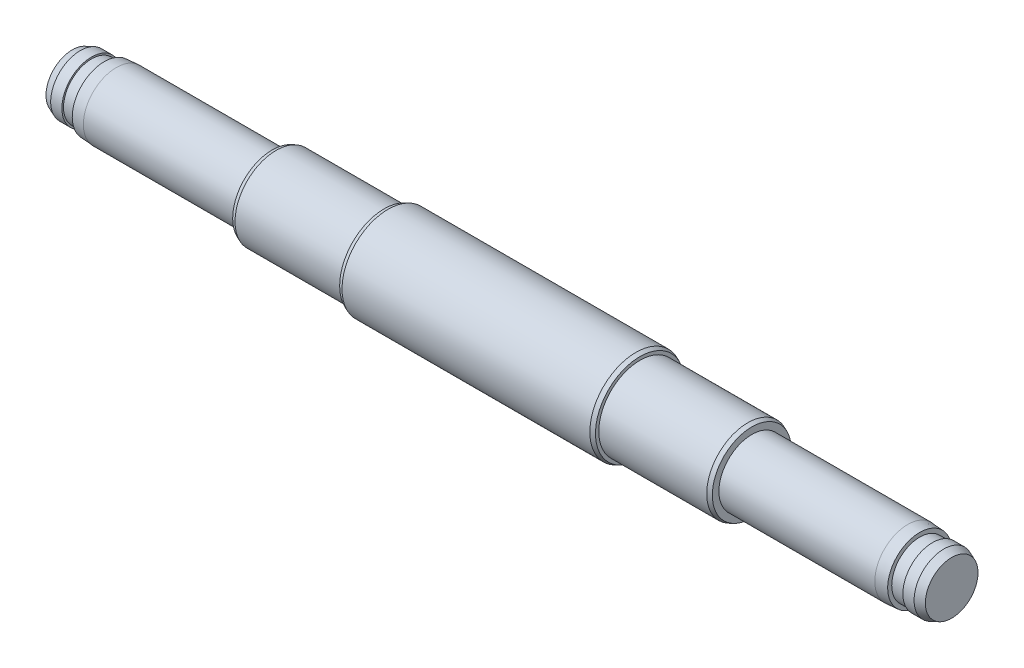
ISO-10303-21;
HEADER;
FILE_DESCRIPTION(('STEP AP214'),'2;1');
FILE_NAME('part.step','',(''),(''),'','','');
FILE_SCHEMA(('AUTOMOTIVE_DESIGN { 1 0 10303 214 1 1 1 1 }'));
ENDSEC;
DATA;
#1=APPLICATION_CONTEXT('core data for automotive mechanical design processes');
#2=APPLICATION_PROTOCOL_DEFINITION('international standard','automotive_design',2000,#1);
#3=PRODUCT_CONTEXT('',#1,'mechanical');
#4=PRODUCT('Part','Part','',(#3));
#5=PRODUCT_RELATED_PRODUCT_CATEGORY('part','',(#4));
#6=PRODUCT_DEFINITION_FORMATION('','',#4);
#7=PRODUCT_DEFINITION_CONTEXT('part definition',#1,'design');
#8=PRODUCT_DEFINITION('design','',#6,#7);
#9=PRODUCT_DEFINITION_SHAPE('','',#8);
#10=(LENGTH_UNIT() NAMED_UNIT(*) SI_UNIT(.MILLI.,.METRE.));
#11=(NAMED_UNIT(*) PLANE_ANGLE_UNIT() SI_UNIT($,.RADIAN.));
#12=(NAMED_UNIT(*) SI_UNIT($,.STERADIAN.) SOLID_ANGLE_UNIT());
#13=UNCERTAINTY_MEASURE_WITH_UNIT(LENGTH_MEASURE(1.E-05),#10,'distance_accuracy_value','');
#14=(GEOMETRIC_REPRESENTATION_CONTEXT(3) GLOBAL_UNCERTAINTY_ASSIGNED_CONTEXT((#13)) GLOBAL_UNIT_ASSIGNED_CONTEXT((#10,
#11,#12)) REPRESENTATION_CONTEXT('',''));
#15=CARTESIAN_POINT('',(0.,0.,0.));
#16=DIRECTION('',(0.,0.,1.));
#17=DIRECTION('',(1.,0.,0.));
#18=AXIS2_PLACEMENT_3D('',#15,#16,#17);
#19=CARTESIAN_POINT('',(0.,0.,0.));
#20=DIRECTION('',(-1.,0.,0.));
#21=DIRECTION('',(0.,0.,1.));
#22=AXIS2_PLACEMENT_3D('',#19,#20,#21);
#23=CYLINDRICAL_SURFACE('',#22,4.9);
#24=CARTESIAN_POINT('',(13.175,0.,0.));
#25=DIRECTION('',(-1.,0.,0.));
#26=DIRECTION('',(0.,-1.,0.));
#27=AXIS2_PLACEMENT_3D('',#24,#25,#26);
#28=CIRCLE('',#27,4.9);
#29=CARTESIAN_POINT('',(13.175,-4.9,0.));
#30=VERTEX_POINT('',#29);
#31=EDGE_CURVE('E51',#30,#30,#28,.T.);
#32=ORIENTED_EDGE('',*,*,#31,.T.);
#33=EDGE_LOOP('',(#32));
#34=FACE_BOUND('',#33,.T.);
#35=CARTESIAN_POINT('',(-13.175,0.,0.));
#36=DIRECTION('',(1.,0.,0.));
#37=DIRECTION('',(0.,0.,-1.));
#38=AXIS2_PLACEMENT_3D('',#35,#36,#37);
#39=CIRCLE('',#38,4.9);
#40=CARTESIAN_POINT('',(-13.175,0.,-4.9));
#41=VERTEX_POINT('',#40);
#42=EDGE_CURVE('E65',#41,#41,#39,.T.);
#43=ORIENTED_EDGE('',*,*,#42,.T.);
#44=EDGE_LOOP('',(#43));
#45=FACE_BOUND('',#44,.T.);
#46=ADVANCED_FACE('F38',(#34,#45),#23,.T.);
#47=CARTESIAN_POINT('',(-13.6,0.,0.));
#48=DIRECTION('',(-1.,0.,0.));
#49=DIRECTION('',(0.,0.,1.));
#50=AXIS2_PLACEMENT_3D('',#47,#48,#49);
#51=PLANE('',#50);
#52=CARTESIAN_POINT('',(-13.6,0.,0.));
#53=DIRECTION('',(-1.,0.,0.));
#54=DIRECTION('',(0.,0.,1.));
#55=AXIS2_PLACEMENT_3D('',#52,#53,#54);
#56=CIRCLE('',#55,4.72499999999999);
#57=CARTESIAN_POINT('',(-13.6,0.,4.72499999999999));
#58=VERTEX_POINT('',#57);
#59=EDGE_CURVE('E10',#58,#58,#56,.T.);
#60=ORIENTED_EDGE('',*,*,#59,.T.);
#61=EDGE_LOOP('',(#60));
#62=FACE_BOUND('',#61,.T.);
#63=CARTESIAN_POINT('',(-13.6,0.,0.));
#64=DIRECTION('',(-1.,0.,0.));
#65=DIRECTION('',(0.,0.,1.));
#66=AXIS2_PLACEMENT_3D('',#63,#64,#65);
#67=CIRCLE('',#66,4.375);
#68=CARTESIAN_POINT('',(-13.6,0.,4.375));
#69=VERTEX_POINT('',#68);
#70=EDGE_CURVE('E57',#69,#69,#67,.T.);
#71=ORIENTED_EDGE('',*,*,#70,.F.);
#72=EDGE_LOOP('',(#71));
#73=FACE_BOUND('',#72,.T.);
#74=ADVANCED_FACE('F147',(#62,#73),#51,.T.);
#75=CARTESIAN_POINT('',(-13.6,0.,0.));
#76=DIRECTION('',(-1.,0.,0.));
#77=DIRECTION('',(0.,0.,1.));
#78=AXIS2_PLACEMENT_3D('',#75,#76,#77);
#79=CYLINDRICAL_SURFACE('',#78,4.375);
#80=CARTESIAN_POINT('',(-25.075,0.,0.));
#81=DIRECTION('',(1.,0.,0.));
#82=DIRECTION('',(0.,1.,0.));
#83=AXIS2_PLACEMENT_3D('',#80,#81,#82);
#84=CIRCLE('',#83,4.375);
#85=CARTESIAN_POINT('',(-25.075,0.,4.375));
#86=VERTEX_POINT('',#85);
#87=EDGE_CURVE('E62',#86,#86,#84,.T.);
#88=CARTESIAN_POINT('',(-25.075,0.,4.375));
#89=CARTESIAN_POINT('',(-24.95546875,0.,4.375));
#90=CARTESIAN_POINT('',(-24.8359375,0.,4.375));
#91=CARTESIAN_POINT('',(-24.596875,0.,4.375));
#92=CARTESIAN_POINT('',(-24.47734375,0.,4.375));
#93=CARTESIAN_POINT('',(-24.23828125,0.,4.375));
#94=CARTESIAN_POINT('',(-24.11875,0.,4.375));
#95=CARTESIAN_POINT('',(-23.8796875,0.,4.375));
#96=CARTESIAN_POINT('',(-23.76015625,0.,4.375));
#97=CARTESIAN_POINT('',(-23.52109375,0.,4.375));
#98=CARTESIAN_POINT('',(-23.4015625,0.,4.375));
#99=CARTESIAN_POINT('',(-23.1625,0.,4.375));
#100=CARTESIAN_POINT('',(-23.04296875,0.,4.375));
#101=CARTESIAN_POINT('',(-22.80390625,0.,4.375));
#102=CARTESIAN_POINT('',(-22.684375,0.,4.375));
#103=CARTESIAN_POINT('',(-22.4453125,0.,4.375));
#104=CARTESIAN_POINT('',(-22.32578125,0.,4.375));
#105=CARTESIAN_POINT('',(-22.08671875,0.,4.375));
#106=CARTESIAN_POINT('',(-21.9671875,0.,4.375));
#107=CARTESIAN_POINT('',(-21.728125,0.,4.375));
#108=CARTESIAN_POINT('',(-21.60859375,0.,4.375));
#109=CARTESIAN_POINT('',(-21.36953125,0.,4.375));
#110=CARTESIAN_POINT('',(-21.25,0.,4.375));
#111=CARTESIAN_POINT('',(-21.0109375,0.,4.375));
#112=CARTESIAN_POINT('',(-20.89140625,0.,4.375));
#113=CARTESIAN_POINT('',(-20.65234375,0.,4.375));
#114=CARTESIAN_POINT('',(-20.5328125,0.,4.375));
#115=CARTESIAN_POINT('',(-20.29375,0.,4.375));
#116=CARTESIAN_POINT('',(-20.17421875,0.,4.375));
#117=CARTESIAN_POINT('',(-19.93515625,0.,4.375));
#118=CARTESIAN_POINT('',(-19.815625,0.,4.375));
#119=CARTESIAN_POINT('',(-19.5765625,0.,4.375));
#120=CARTESIAN_POINT('',(-19.45703125,0.,4.375));
#121=CARTESIAN_POINT('',(-19.21796875,0.,4.375));
#122=CARTESIAN_POINT('',(-19.0984375,0.,4.375));
#123=CARTESIAN_POINT('',(-18.859375,0.,4.375));
#124=CARTESIAN_POINT('',(-18.73984375,0.,4.375));
#125=CARTESIAN_POINT('',(-18.50078125,0.,4.375));
#126=CARTESIAN_POINT('',(-18.38125,0.,4.375));
#127=CARTESIAN_POINT('',(-18.1421875,0.,4.375));
#128=CARTESIAN_POINT('',(-18.02265625,0.,4.375));
#129=CARTESIAN_POINT('',(-17.78359375,0.,4.375));
#130=CARTESIAN_POINT('',(-17.6640625,0.,4.375));
#131=CARTESIAN_POINT('',(-17.425,0.,4.375));
#132=CARTESIAN_POINT('',(-17.30546875,0.,4.375));
#133=CARTESIAN_POINT('',(-17.06640625,0.,4.375));
#134=CARTESIAN_POINT('',(-16.946875,0.,4.375));
#135=CARTESIAN_POINT('',(-16.7078125,0.,4.375));
#136=CARTESIAN_POINT('',(-16.58828125,0.,4.375));
#137=CARTESIAN_POINT('',(-16.34921875,0.,4.375));
#138=CARTESIAN_POINT('',(-16.2296875,0.,4.375));
#139=CARTESIAN_POINT('',(-15.990625,0.,4.375));
#140=CARTESIAN_POINT('',(-15.87109375,0.,4.375));
#141=CARTESIAN_POINT('',(-15.63203125,0.,4.375));
#142=CARTESIAN_POINT('',(-15.5125,0.,4.375));
#143=CARTESIAN_POINT('',(-15.2734375,0.,4.375));
#144=CARTESIAN_POINT('',(-15.15390625,0.,4.375));
#145=CARTESIAN_POINT('',(-14.91484375,0.,4.375));
#146=CARTESIAN_POINT('',(-14.7953125,0.,4.375));
#147=CARTESIAN_POINT('',(-14.55625,0.,4.375));
#148=CARTESIAN_POINT('',(-14.43671875,0.,4.375));
#149=CARTESIAN_POINT('',(-14.19765625,0.,4.375));
#150=CARTESIAN_POINT('',(-14.078125,0.,4.375));
#151=CARTESIAN_POINT('',(-13.8390625,0.,4.375));
#152=CARTESIAN_POINT('',(-13.71953125,0.,4.375));
#153=CARTESIAN_POINT('',(-13.6,0.,4.375));
#154=B_SPLINE_CURVE_WITH_KNOTS('',3,(#88,#89,#90,#91,#92,#93,#94,#95,#96,#97,#98,#99,#100,#101,
#102,#103,#104,#105,#106,#107,#108,#109,#110,#111,#112,#113,#114,#115,#116,#117,#118,#119,#120,
#121,#122,#123,#124,#125,#126,#127,#128,#129,#130,#131,#132,#133,#134,#135,#136,#137,#138,#139,
#140,#141,#142,#143,#144,#145,#146,#147,#148,#149,#150,#151,#152,#153),.UNSPECIFIED.,.F.,.F.,(4,
2,2,2,2,2,2,2,2,2,2,2,2,2,2,2,2,2,2,2,2,2,2,2,2,2,2,2,2,2,2,2,4),(0.,0.35859375,
0.717187500000001,1.07578125,1.434375,1.79296875,2.1515625,2.51015625,2.86875,3.22734375,
3.5859375,3.94453125,4.303125,4.66171875,5.0203125,5.37890625,5.7375,6.09609375,6.4546875,
6.81328125,7.171875,7.53046875,7.8890625,8.24765625,8.60625,8.96484375,9.3234375,9.68203125,
10.040625,10.39921875,10.7578125,11.11640625,11.475),.UNSPECIFIED.);
#155=EDGE_CURVE('BSEAM152',#86,#69,#154,.T.);
#156=ORIENTED_EDGE('',*,*,#87,.T.);
#157=ORIENTED_EDGE('',*,*,#70,.T.);
#158=ORIENTED_EDGE('',*,*,#155,.T.);
#159=ORIENTED_EDGE('',*,*,#155,.F.);
#160=EDGE_LOOP('',(#156,#158,#157,#159));
#161=FACE_BOUND('',#160,.T.);
#162=ADVANCED_FACE('F152',(#161),#79,.T.);
#163=CARTESIAN_POINT('',(-46.75,3.15,0.));
#164=DIRECTION('',(1.,0.,0.));
#165=DIRECTION('',(0.,0.,1.));
#166=AXIS2_PLACEMENT_3D('',#163,#164,#165);
#167=PLANE('',#166);
#168=CARTESIAN_POINT('',(-46.75,0.,0.));
#169=DIRECTION('',(-1.,0.,0.));
#170=DIRECTION('',(0.,-1.,0.));
#171=AXIS2_PLACEMENT_3D('',#168,#169,#170);
#172=CIRCLE('',#171,2.8);
#173=CARTESIAN_POINT('',(-46.75,-2.8,0.));
#174=VERTEX_POINT('',#173);
#175=EDGE_CURVE('E42',#174,#174,#172,.T.);
#176=ORIENTED_EDGE('',*,*,#175,.T.);
#177=EDGE_LOOP('',(#176));
#178=FACE_BOUND('',#177,.T.);
#179=ADVANCED_FACE('F157',(#178),#167,.F.);
#180=CARTESIAN_POINT('',(-45.9,0.,0.));
#181=DIRECTION('',(1.,0.,0.));
#182=DIRECTION('',(0.,1.,0.));
#183=AXIS2_PLACEMENT_3D('',#180,#181,#182);
#184=CONICAL_SURFACE('',#183,3.15,0.390607043697686);
#185=CARTESIAN_POINT('',(-45.9,0.,0.));
#186=DIRECTION('',(1.,0.,0.));
#187=DIRECTION('',(0.,0.,-1.));
#188=AXIS2_PLACEMENT_3D('',#185,#186,#187);
#189=CIRCLE('',#188,3.15);
#190=CARTESIAN_POINT('',(-45.9,0.,-3.15));
#191=VERTEX_POINT('',#190);
#192=EDGE_CURVE('E91',#191,#191,#189,.T.);
#193=ORIENTED_EDGE('',*,*,#192,.F.);
#194=EDGE_LOOP('',(#193));
#195=FACE_BOUND('',#194,.T.);
#196=ORIENTED_EDGE('',*,*,#175,.F.);
#197=EDGE_LOOP('',(#196));
#198=FACE_BOUND('',#197,.T.);
#199=ADVANCED_FACE('F161',(#195,#198),#184,.T.);
#200=CARTESIAN_POINT('',(0.,0.,0.));
#201=DIRECTION('',(1.,0.,0.));
#202=DIRECTION('',(0.,0.,-1.));
#203=AXIS2_PLACEMENT_3D('',#200,#201,#202);
#204=CYLINDRICAL_SURFACE('',#203,3.15);
#205=ORIENTED_EDGE('',*,*,#192,.T.);
#206=EDGE_LOOP('',(#205));
#207=FACE_BOUND('',#206,.T.);
#208=CARTESIAN_POINT('',(-44.71,0.,0.));
#209=DIRECTION('',(1.,0.,0.));
#210=DIRECTION('',(0.,0.,-1.));
#211=AXIS2_PLACEMENT_3D('',#208,#209,#210);
#212=CIRCLE('',#211,3.15);
#213=CARTESIAN_POINT('',(-44.71,0.,-3.15));
#214=VERTEX_POINT('',#213);
#215=EDGE_CURVE('E88',#214,#214,#212,.T.);
#216=ORIENTED_EDGE('',*,*,#215,.F.);
#217=EDGE_LOOP('',(#216));
#218=FACE_BOUND('',#217,.T.);
#219=ADVANCED_FACE('F164',(#207,#218),#204,.T.);
#220=CARTESIAN_POINT('',(-44.71,0.,-2.975));
#221=DIRECTION('',(1.,0.,0.));
#222=DIRECTION('',(0.,0.,1.));
#223=AXIS2_PLACEMENT_3D('',#220,#221,#222);
#224=PLANE('',#223);
#225=CARTESIAN_POINT('',(-44.71,0.,0.));
#226=DIRECTION('',(-1.,0.,0.));
#227=DIRECTION('',(0.,0.,1.));
#228=AXIS2_PLACEMENT_3D('',#225,#226,#227);
#229=CIRCLE('',#228,2.975);
#230=CARTESIAN_POINT('',(-44.71,0.,2.975));
#231=VERTEX_POINT('',#230);
#232=EDGE_CURVE('E85',#231,#231,#229,.T.);
#233=ORIENTED_EDGE('',*,*,#232,.T.);
#234=EDGE_LOOP('',(#233));
#235=FACE_BOUND('',#234,.T.);
#236=ORIENTED_EDGE('',*,*,#215,.T.);
#237=EDGE_LOOP('',(#236));
#238=FACE_BOUND('',#237,.T.);
#239=ADVANCED_FACE('F168',(#235,#238),#224,.T.);
#240=CARTESIAN_POINT('',(0.,0.,0.));
#241=DIRECTION('',(1.,0.,0.));
#242=DIRECTION('',(0.,0.,-1.));
#243=AXIS2_PLACEMENT_3D('',#240,#241,#242);
#244=CYLINDRICAL_SURFACE('',#243,2.975);
#245=ORIENTED_EDGE('',*,*,#232,.F.);
#246=EDGE_LOOP('',(#245));
#247=FACE_BOUND('',#246,.T.);
#248=CARTESIAN_POINT('',(-43.35,0.,0.));
#249=DIRECTION('',(-1.,0.,0.));
#250=DIRECTION('',(0.,0.,1.));
#251=AXIS2_PLACEMENT_3D('',#248,#249,#250);
#252=CIRCLE('',#251,2.975);
#253=CARTESIAN_POINT('',(-43.35,0.,2.975));
#254=VERTEX_POINT('',#253);
#255=EDGE_CURVE('E60',#254,#254,#252,.T.);
#256=ORIENTED_EDGE('',*,*,#255,.T.);
#257=EDGE_LOOP('',(#256));
#258=FACE_BOUND('',#257,.T.);
#259=ADVANCED_FACE('F171',(#247,#258),#244,.T.);
#260=CARTESIAN_POINT('',(-43.35,3.5,0.));
#261=DIRECTION('',(1.,0.,0.));
#262=DIRECTION('',(0.,0.,1.));
#263=AXIS2_PLACEMENT_3D('',#260,#261,#262);
#264=PLANE('',#263);
#265=CARTESIAN_POINT('',(-43.35,0.,0.));
#266=DIRECTION('',(-1.,0.,0.));
#267=DIRECTION('',(0.,0.,1.));
#268=AXIS2_PLACEMENT_3D('',#265,#266,#267);
#269=CIRCLE('',#268,3.40742833512805);
#270=CARTESIAN_POINT('',(-43.35,0.,3.40742833512805));
#271=VERTEX_POINT('',#270);
#272=EDGE_CURVE('E79',#271,#271,#269,.T.);
#273=ORIENTED_EDGE('',*,*,#272,.T.);
#274=EDGE_LOOP('',(#273));
#275=FACE_BOUND('',#274,.T.);
#276=ORIENTED_EDGE('',*,*,#255,.F.);
#277=EDGE_LOOP('',(#276));
#278=FACE_BOUND('',#277,.T.);
#279=ADVANCED_FACE('F175',(#275,#278),#264,.F.);
#280=CARTESIAN_POINT('',(-42.075,0.,0.));
#281=DIRECTION('',(1.,0.,0.));
#282=DIRECTION('',(0.,0.,-1.));
#283=AXIS2_PLACEMENT_3D('',#280,#281,#282);
#284=CONICAL_SURFACE('',#283,3.5,0.072478049415304);
#285=CARTESIAN_POINT('',(-42.075,0.,0.));
#286=DIRECTION('',(1.,0.,0.));
#287=DIRECTION('',(0.,1.,0.));
#288=AXIS2_PLACEMENT_3D('',#285,#286,#287);
#289=CIRCLE('',#288,3.5);
#290=CARTESIAN_POINT('',(-42.075,3.5,0.));
#291=VERTEX_POINT('',#290);
#292=EDGE_CURVE('E75',#291,#291,#289,.T.);
#293=ORIENTED_EDGE('',*,*,#292,.F.);
#294=EDGE_LOOP('',(#293));
#295=FACE_BOUND('',#294,.T.);
#296=ORIENTED_EDGE('',*,*,#272,.F.);
#297=EDGE_LOOP('',(#296));
#298=FACE_BOUND('',#297,.T.);
#299=ADVANCED_FACE('F179',(#295,#298),#284,.T.);
#300=CARTESIAN_POINT('',(0.,0.,0.));
#301=DIRECTION('',(1.,0.,0.));
#302=DIRECTION('',(0.,0.,-1.));
#303=AXIS2_PLACEMENT_3D('',#300,#301,#302);
#304=CYLINDRICAL_SURFACE('',#303,3.5);
#305=ORIENTED_EDGE('',*,*,#292,.T.);
#306=EDGE_LOOP('',(#305));
#307=FACE_BOUND('',#306,.T.);
#308=CARTESIAN_POINT('',(-25.5,0.,0.));
#309=DIRECTION('',(-1.,0.,0.));
#310=DIRECTION('',(0.,0.,1.));
#311=AXIS2_PLACEMENT_3D('',#308,#309,#310);
#312=CIRCLE('',#311,3.5);
#313=CARTESIAN_POINT('',(-25.5,0.,3.5));
#314=VERTEX_POINT('',#313);
#315=EDGE_CURVE('E70',#314,#314,#312,.T.);
#316=ORIENTED_EDGE('',*,*,#315,.T.);
#317=EDGE_LOOP('',(#316));
#318=FACE_BOUND('',#317,.T.);
#319=ADVANCED_FACE('F183',(#307,#318),#304,.T.);
#320=CARTESIAN_POINT('',(-25.5,4.9,0.));
#321=DIRECTION('',(1.,0.,0.));
#322=DIRECTION('',(0.,0.,1.));
#323=AXIS2_PLACEMENT_3D('',#320,#321,#322);
#324=PLANE('',#323);
#325=CARTESIAN_POINT('',(-25.5,0.,0.));
#326=DIRECTION('',(-1.,0.,0.));
#327=DIRECTION('',(0.,0.,1.));
#328=AXIS2_PLACEMENT_3D('',#325,#326,#327);
#329=CIRCLE('',#328,4.19999999999999);
#330=CARTESIAN_POINT('',(-25.5,0.,4.19999999999999));
#331=VERTEX_POINT('',#330);
#332=EDGE_CURVE('E66',#331,#331,#329,.T.);
#333=ORIENTED_EDGE('',*,*,#332,.T.);
#334=EDGE_LOOP('',(#333));
#335=FACE_BOUND('',#334,.T.);
#336=ORIENTED_EDGE('',*,*,#315,.F.);
#337=EDGE_LOOP('',(#336));
#338=FACE_BOUND('',#337,.T.);
#339=ADVANCED_FACE('F187',(#335,#338),#324,.F.);
#340=CARTESIAN_POINT('',(13.6,0.,0.));
#341=DIRECTION('',(1.,0.,0.));
#342=DIRECTION('',(0.,0.,1.));
#343=AXIS2_PLACEMENT_3D('',#340,#341,#342);
#344=PLANE('',#343);
#345=CARTESIAN_POINT('',(13.6,0.,0.));
#346=DIRECTION('',(1.,0.,0.));
#347=DIRECTION('',(0.,0.,-1.));
#348=AXIS2_PLACEMENT_3D('',#345,#346,#347);
#349=CIRCLE('',#348,4.725);
#350=CARTESIAN_POINT('',(13.6,0.,-4.725));
#351=VERTEX_POINT('',#350);
#352=EDGE_CURVE('E46',#351,#351,#349,.T.);
#353=ORIENTED_EDGE('',*,*,#352,.T.);
#354=EDGE_LOOP('',(#353));
#355=FACE_BOUND('',#354,.T.);
#356=CARTESIAN_POINT('',(13.6,0.,0.));
#357=DIRECTION('',(-1.,0.,0.));
#358=DIRECTION('',(0.,0.,1.));
#359=AXIS2_PLACEMENT_3D('',#356,#357,#358);
#360=CIRCLE('',#359,4.375);
#361=CARTESIAN_POINT('',(13.6,0.,-4.375));
#362=VERTEX_POINT('',#361);
#363=EDGE_CURVE('E61',#362,#362,#360,.T.);
#364=ORIENTED_EDGE('',*,*,#363,.T.);
#365=EDGE_LOOP('',(#364));
#366=FACE_BOUND('',#365,.T.);
#367=ADVANCED_FACE('F191',(#355,#366),#344,.T.);
#368=CARTESIAN_POINT('',(13.6,0.,0.));
#369=DIRECTION('',(1.,0.,0.));
#370=DIRECTION('',(0.,0.,-1.));
#371=AXIS2_PLACEMENT_3D('',#368,#369,#370);
#372=CYLINDRICAL_SURFACE('',#371,4.375);
#373=CARTESIAN_POINT('',(25.075,0.,0.));
#374=DIRECTION('',(-1.,0.,0.));
#375=DIRECTION('',(0.,0.,1.));
#376=AXIS2_PLACEMENT_3D('',#373,#374,#375);
#377=CIRCLE('',#376,4.375);
#378=CARTESIAN_POINT('',(25.075,0.,-4.375));
#379=VERTEX_POINT('',#378);
#380=EDGE_CURVE('E93',#379,#379,#377,.T.);
#381=CARTESIAN_POINT('',(25.075,0.,-4.375));
#382=CARTESIAN_POINT('',(24.95546875,0.,-4.375));
#383=CARTESIAN_POINT('',(24.8359375,0.,-4.375));
#384=CARTESIAN_POINT('',(24.596875,0.,-4.375));
#385=CARTESIAN_POINT('',(24.47734375,0.,-4.375));
#386=CARTESIAN_POINT('',(24.23828125,0.,-4.375));
#387=CARTESIAN_POINT('',(24.11875,0.,-4.375));
#388=CARTESIAN_POINT('',(23.8796875,0.,-4.375));
#389=CARTESIAN_POINT('',(23.76015625,0.,-4.375));
#390=CARTESIAN_POINT('',(23.52109375,0.,-4.375));
#391=CARTESIAN_POINT('',(23.4015625,0.,-4.375));
#392=CARTESIAN_POINT('',(23.1625,0.,-4.375));
#393=CARTESIAN_POINT('',(23.04296875,0.,-4.375));
#394=CARTESIAN_POINT('',(22.80390625,0.,-4.375));
#395=CARTESIAN_POINT('',(22.684375,0.,-4.375));
#396=CARTESIAN_POINT('',(22.4453125,0.,-4.375));
#397=CARTESIAN_POINT('',(22.32578125,0.,-4.375));
#398=CARTESIAN_POINT('',(22.08671875,0.,-4.375));
#399=CARTESIAN_POINT('',(21.9671875,0.,-4.375));
#400=CARTESIAN_POINT('',(21.728125,0.,-4.375));
#401=CARTESIAN_POINT('',(21.60859375,0.,-4.375));
#402=CARTESIAN_POINT('',(21.36953125,0.,-4.375));
#403=CARTESIAN_POINT('',(21.25,0.,-4.375));
#404=CARTESIAN_POINT('',(21.0109375,0.,-4.375));
#405=CARTESIAN_POINT('',(20.89140625,0.,-4.375));
#406=CARTESIAN_POINT('',(20.65234375,0.,-4.375));
#407=CARTESIAN_POINT('',(20.5328125,0.,-4.375));
#408=CARTESIAN_POINT('',(20.29375,0.,-4.375));
#409=CARTESIAN_POINT('',(20.17421875,0.,-4.375));
#410=CARTESIAN_POINT('',(19.93515625,0.,-4.375));
#411=CARTESIAN_POINT('',(19.815625,0.,-4.375));
#412=CARTESIAN_POINT('',(19.5765625,0.,-4.375));
#413=CARTESIAN_POINT('',(19.45703125,0.,-4.375));
#414=CARTESIAN_POINT('',(19.21796875,0.,-4.375));
#415=CARTESIAN_POINT('',(19.0984375,0.,-4.375));
#416=CARTESIAN_POINT('',(18.859375,0.,-4.375));
#417=CARTESIAN_POINT('',(18.73984375,0.,-4.375));
#418=CARTESIAN_POINT('',(18.50078125,0.,-4.375));
#419=CARTESIAN_POINT('',(18.38125,0.,-4.375));
#420=CARTESIAN_POINT('',(18.1421875,0.,-4.375));
#421=CARTESIAN_POINT('',(18.02265625,0.,-4.375));
#422=CARTESIAN_POINT('',(17.78359375,0.,-4.375));
#423=CARTESIAN_POINT('',(17.6640625,0.,-4.375));
#424=CARTESIAN_POINT('',(17.425,0.,-4.375));
#425=CARTESIAN_POINT('',(17.30546875,0.,-4.375));
#426=CARTESIAN_POINT('',(17.06640625,0.,-4.375));
#427=CARTESIAN_POINT('',(16.946875,0.,-4.375));
#428=CARTESIAN_POINT('',(16.7078125,0.,-4.375));
#429=CARTESIAN_POINT('',(16.58828125,0.,-4.375));
#430=CARTESIAN_POINT('',(16.34921875,0.,-4.375));
#431=CARTESIAN_POINT('',(16.2296875,0.,-4.375));
#432=CARTESIAN_POINT('',(15.990625,0.,-4.375));
#433=CARTESIAN_POINT('',(15.87109375,0.,-4.375));
#434=CARTESIAN_POINT('',(15.63203125,0.,-4.375));
#435=CARTESIAN_POINT('',(15.5125,0.,-4.375));
#436=CARTESIAN_POINT('',(15.2734375,0.,-4.375));
#437=CARTESIAN_POINT('',(15.15390625,0.,-4.375));
#438=CARTESIAN_POINT('',(14.91484375,0.,-4.375));
#439=CARTESIAN_POINT('',(14.7953125,0.,-4.375));
#440=CARTESIAN_POINT('',(14.55625,0.,-4.375));
#441=CARTESIAN_POINT('',(14.43671875,0.,-4.375));
#442=CARTESIAN_POINT('',(14.19765625,0.,-4.375));
#443=CARTESIAN_POINT('',(14.078125,0.,-4.375));
#444=CARTESIAN_POINT('',(13.8390625,0.,-4.375));
#445=CARTESIAN_POINT('',(13.71953125,0.,-4.375));
#446=CARTESIAN_POINT('',(13.6,0.,-4.375));
#447=B_SPLINE_CURVE_WITH_KNOTS('',3,(#381,#382,#383,#384,#385,#386,#387,#388,#389,#390,#391,
#392,#393,#394,#395,#396,#397,#398,#399,#400,#401,#402,#403,#404,#405,#406,#407,#408,#409,#410,
#411,#412,#413,#414,#415,#416,#417,#418,#419,#420,#421,#422,#423,#424,#425,#426,#427,#428,#429,
#430,#431,#432,#433,#434,#435,#436,#437,#438,#439,#440,#441,#442,#443,#444,#445,#446),
.UNSPECIFIED.,.F.,.F.,(4,2,2,2,2,2,2,2,2,2,2,2,2,2,2,2,2,2,2,2,2,2,2,2,2,2,2,2,2,2,2,2,4),(0.,
0.35859375,0.717187500000001,1.07578125,1.434375,1.79296875,2.1515625,2.51015625,2.86875,
3.22734375,3.5859375,3.94453125,4.303125,4.66171875,5.0203125,5.37890625,5.7375,6.09609375,
6.4546875,6.81328125,7.171875,7.53046875,7.8890625,8.24765625,8.60625,8.96484375,9.3234375,
9.68203125,10.040625,10.39921875,10.7578125,11.11640625,11.475),.UNSPECIFIED.);
#448=EDGE_CURVE('BSEAM195',#379,#362,#447,.T.);
#449=ORIENTED_EDGE('',*,*,#380,.T.);
#450=ORIENTED_EDGE('',*,*,#363,.F.);
#451=ORIENTED_EDGE('',*,*,#448,.T.);
#452=ORIENTED_EDGE('',*,*,#448,.F.);
#453=EDGE_LOOP('',(#449,#451,#450,#452));
#454=FACE_BOUND('',#453,.T.);
#455=ADVANCED_FACE('F195',(#454),#372,.T.);
#456=CARTESIAN_POINT('',(46.75,3.15,0.));
#457=DIRECTION('',(-1.,0.,0.));
#458=DIRECTION('',(0.,0.,1.));
#459=AXIS2_PLACEMENT_3D('',#456,#457,#458);
#460=PLANE('',#459);
#461=CARTESIAN_POINT('',(46.75,0.,0.));
#462=DIRECTION('',(1.,0.,0.));
#463=DIRECTION('',(0.,1.,0.));
#464=AXIS2_PLACEMENT_3D('',#461,#462,#463);
#465=CIRCLE('',#464,2.80000000000001);
#466=CARTESIAN_POINT('',(46.75,2.80000000000001,0.));
#467=VERTEX_POINT('',#466);
#468=EDGE_CURVE('E55',#467,#467,#465,.T.);
#469=ORIENTED_EDGE('',*,*,#468,.T.);
#470=EDGE_LOOP('',(#469));
#471=FACE_BOUND('',#470,.T.);
#472=ADVANCED_FACE('F199',(#471),#460,.F.);
#473=CARTESIAN_POINT('',(45.9,0.,0.));
#474=DIRECTION('',(-1.,0.,0.));
#475=DIRECTION('',(0.,-1.,0.));
#476=AXIS2_PLACEMENT_3D('',#473,#474,#475);
#477=CONICAL_SURFACE('',#476,3.15,0.39060704369769);
#478=ORIENTED_EDGE('',*,*,#468,.F.);
#479=EDGE_LOOP('',(#478));
#480=FACE_BOUND('',#479,.T.);
#481=CARTESIAN_POINT('',(45.9,0.,0.));
#482=DIRECTION('',(-1.,0.,0.));
#483=DIRECTION('',(0.,0.,1.));
#484=AXIS2_PLACEMENT_3D('',#481,#482,#483);
#485=CIRCLE('',#484,3.15);
#486=CARTESIAN_POINT('',(45.9,0.,3.15));
#487=VERTEX_POINT('',#486);
#488=EDGE_CURVE('E78',#487,#487,#485,.T.);
#489=ORIENTED_EDGE('',*,*,#488,.F.);
#490=EDGE_LOOP('',(#489));
#491=FACE_BOUND('',#490,.T.);
#492=ADVANCED_FACE('F203',(#480,#491),#477,.T.);
#493=CARTESIAN_POINT('',(0.,0.,0.));
#494=DIRECTION('',(-1.,0.,0.));
#495=DIRECTION('',(0.,0.,1.));
#496=AXIS2_PLACEMENT_3D('',#493,#494,#495);
#497=CYLINDRICAL_SURFACE('',#496,3.15);
#498=ORIENTED_EDGE('',*,*,#488,.T.);
#499=EDGE_LOOP('',(#498));
#500=FACE_BOUND('',#499,.T.);
#501=CARTESIAN_POINT('',(44.71,0.,0.));
#502=DIRECTION('',(-1.,0.,0.));
#503=DIRECTION('',(0.,0.,1.));
#504=AXIS2_PLACEMENT_3D('',#501,#502,#503);
#505=CIRCLE('',#504,3.15);
#506=CARTESIAN_POINT('',(44.71,0.,3.15));
#507=VERTEX_POINT('',#506);
#508=EDGE_CURVE('E74',#507,#507,#505,.T.);
#509=ORIENTED_EDGE('',*,*,#508,.F.);
#510=EDGE_LOOP('',(#509));
#511=FACE_BOUND('',#510,.T.);
#512=ADVANCED_FACE('F206',(#500,#511),#497,.T.);
#513=CARTESIAN_POINT('',(44.71,0.,-2.975));
#514=DIRECTION('',(-1.,0.,0.));
#515=DIRECTION('',(0.,0.,1.));
#516=AXIS2_PLACEMENT_3D('',#513,#514,#515);
#517=PLANE('',#516);
#518=CARTESIAN_POINT('',(44.71,0.,0.));
#519=DIRECTION('',(-1.,0.,0.));
#520=DIRECTION('',(0.,0.,1.));
#521=AXIS2_PLACEMENT_3D('',#518,#519,#520);
#522=CIRCLE('',#521,2.975);
#523=CARTESIAN_POINT('',(44.71,0.,2.975));
#524=VERTEX_POINT('',#523);
#525=EDGE_CURVE('E110',#524,#524,#522,.T.);
#526=ORIENTED_EDGE('',*,*,#525,.F.);
#527=EDGE_LOOP('',(#526));
#528=FACE_BOUND('',#527,.T.);
#529=ORIENTED_EDGE('',*,*,#508,.T.);
#530=EDGE_LOOP('',(#529));
#531=FACE_BOUND('',#530,.T.);
#532=ADVANCED_FACE('F210',(#528,#531),#517,.T.);
#533=CARTESIAN_POINT('',(0.,0.,0.));
#534=DIRECTION('',(-1.,0.,0.));
#535=DIRECTION('',(0.,0.,1.));
#536=AXIS2_PLACEMENT_3D('',#533,#534,#535);
#537=CYLINDRICAL_SURFACE('',#536,2.975);
#538=ORIENTED_EDGE('',*,*,#525,.T.);
#539=EDGE_LOOP('',(#538));
#540=FACE_BOUND('',#539,.T.);
#541=CARTESIAN_POINT('',(43.35,0.,0.));
#542=DIRECTION('',(-1.,0.,0.));
#543=DIRECTION('',(0.,0.,1.));
#544=AXIS2_PLACEMENT_3D('',#541,#542,#543);
#545=CIRCLE('',#544,2.975);
#546=CARTESIAN_POINT('',(43.35,0.,2.975));
#547=VERTEX_POINT('',#546);
#548=EDGE_CURVE('E90',#547,#547,#545,.T.);
#549=ORIENTED_EDGE('',*,*,#548,.F.);
#550=EDGE_LOOP('',(#549));
#551=FACE_BOUND('',#550,.T.);
#552=ADVANCED_FACE('F213',(#540,#551),#537,.T.);
#553=CARTESIAN_POINT('',(43.35,3.5,0.));
#554=DIRECTION('',(-1.,0.,0.));
#555=DIRECTION('',(0.,0.,1.));
#556=AXIS2_PLACEMENT_3D('',#553,#554,#555);
#557=PLANE('',#556);
#558=CARTESIAN_POINT('',(43.35,0.,0.));
#559=DIRECTION('',(1.,0.,0.));
#560=DIRECTION('',(0.,0.,-1.));
#561=AXIS2_PLACEMENT_3D('',#558,#559,#560);
#562=CIRCLE('',#561,3.40742833512805);
#563=CARTESIAN_POINT('',(43.35,0.,-3.40742833512805));
#564=VERTEX_POINT('',#563);
#565=EDGE_CURVE('E82',#564,#564,#562,.T.);
#566=ORIENTED_EDGE('',*,*,#565,.T.);
#567=EDGE_LOOP('',(#566));
#568=FACE_BOUND('',#567,.T.);
#569=ORIENTED_EDGE('',*,*,#548,.T.);
#570=EDGE_LOOP('',(#569));
#571=FACE_BOUND('',#570,.T.);
#572=ADVANCED_FACE('F217',(#568,#571),#557,.F.);
#573=CARTESIAN_POINT('',(42.075,0.,0.));
#574=DIRECTION('',(-1.,0.,0.));
#575=DIRECTION('',(0.,0.,1.));
#576=AXIS2_PLACEMENT_3D('',#573,#574,#575);
#577=CONICAL_SURFACE('',#576,3.5,0.072478049415304);
#578=ORIENTED_EDGE('',*,*,#565,.F.);
#579=EDGE_LOOP('',(#578));
#580=FACE_BOUND('',#579,.T.);
#581=CARTESIAN_POINT('',(42.075,0.,0.));
#582=DIRECTION('',(-1.,0.,0.));
#583=DIRECTION('',(0.,-1.,0.));
#584=AXIS2_PLACEMENT_3D('',#581,#582,#583);
#585=CIRCLE('',#584,3.5);
#586=CARTESIAN_POINT('',(42.075,-3.5,0.));
#587=VERTEX_POINT('',#586);
#588=EDGE_CURVE('E117',#587,#587,#585,.T.);
#589=ORIENTED_EDGE('',*,*,#588,.F.);
#590=EDGE_LOOP('',(#589));
#591=FACE_BOUND('',#590,.T.);
#592=ADVANCED_FACE('F221',(#580,#591),#577,.T.);
#593=CARTESIAN_POINT('',(0.,0.,0.));
#594=DIRECTION('',(-1.,0.,0.));
#595=DIRECTION('',(0.,0.,1.));
#596=AXIS2_PLACEMENT_3D('',#593,#594,#595);
#597=CYLINDRICAL_SURFACE('',#596,3.5);
#598=ORIENTED_EDGE('',*,*,#588,.T.);
#599=EDGE_LOOP('',(#598));
#600=FACE_BOUND('',#599,.T.);
#601=CARTESIAN_POINT('',(25.5,0.,0.));
#602=DIRECTION('',(-1.,0.,0.));
#603=DIRECTION('',(0.,0.,1.));
#604=AXIS2_PLACEMENT_3D('',#601,#602,#603);
#605=CIRCLE('',#604,3.5);
#606=CARTESIAN_POINT('',(25.5,0.,3.5));
#607=VERTEX_POINT('',#606);
#608=EDGE_CURVE('E73',#607,#607,#605,.T.);
#609=ORIENTED_EDGE('',*,*,#608,.F.);
#610=EDGE_LOOP('',(#609));
#611=FACE_BOUND('',#610,.T.);
#612=ADVANCED_FACE('F225',(#600,#611),#597,.T.);
#613=CARTESIAN_POINT('',(25.5,4.9,0.));
#614=DIRECTION('',(-1.,0.,0.));
#615=DIRECTION('',(0.,0.,1.));
#616=AXIS2_PLACEMENT_3D('',#613,#614,#615);
#617=PLANE('',#616);
#618=CARTESIAN_POINT('',(25.5,0.,0.));
#619=DIRECTION('',(1.,0.,0.));
#620=DIRECTION('',(0.,0.,-1.));
#621=AXIS2_PLACEMENT_3D('',#618,#619,#620);
#622=CIRCLE('',#621,4.2);
#623=CARTESIAN_POINT('',(25.5,0.,-4.2));
#624=VERTEX_POINT('',#623);
#625=EDGE_CURVE('E69',#624,#624,#622,.T.);
#626=ORIENTED_EDGE('',*,*,#625,.T.);
#627=EDGE_LOOP('',(#626));
#628=FACE_BOUND('',#627,.T.);
#629=ORIENTED_EDGE('',*,*,#608,.T.);
#630=EDGE_LOOP('',(#629));
#631=FACE_BOUND('',#630,.T.);
#632=ADVANCED_FACE('F229',(#628,#631),#617,.F.);
#633=CARTESIAN_POINT('',(25.075,0.,0.));
#634=DIRECTION('',(-1.,0.,0.));
#635=DIRECTION('',(0.,0.,1.));
#636=AXIS2_PLACEMENT_3D('',#633,#634,#635);
#637=CONICAL_SURFACE('',#636,4.375,0.390607043697688);
#638=ORIENTED_EDGE('',*,*,#625,.F.);
#639=EDGE_LOOP('',(#638));
#640=FACE_BOUND('',#639,.T.);
#641=ORIENTED_EDGE('',*,*,#380,.F.);
#642=EDGE_LOOP('',(#641));
#643=FACE_BOUND('',#642,.T.);
#644=ADVANCED_FACE('F142',(#640,#643),#637,.T.);
#645=CARTESIAN_POINT('',(-25.075,0.,0.));
#646=DIRECTION('',(1.,0.,0.));
#647=DIRECTION('',(0.,0.,-1.));
#648=AXIS2_PLACEMENT_3D('',#645,#646,#647);
#649=CONICAL_SURFACE('',#648,4.375,0.390607043697694);
#650=ORIENTED_EDGE('',*,*,#87,.F.);
#651=EDGE_LOOP('',(#650));
#652=FACE_BOUND('',#651,.T.);
#653=ORIENTED_EDGE('',*,*,#332,.F.);
#654=EDGE_LOOP('',(#653));
#655=FACE_BOUND('',#654,.T.);
#656=ADVANCED_FACE('F135',(#652,#655),#649,.T.);
#657=CARTESIAN_POINT('',(13.175,0.,0.));
#658=DIRECTION('',(-1.,0.,0.));
#659=DIRECTION('',(0.,-1.,0.));
#660=AXIS2_PLACEMENT_3D('',#657,#658,#659);
#661=CONICAL_SURFACE('',#660,4.9,0.390607043697692);
#662=ORIENTED_EDGE('',*,*,#352,.F.);
#663=EDGE_LOOP('',(#662));
#664=FACE_BOUND('',#663,.T.);
#665=ORIENTED_EDGE('',*,*,#31,.F.);
#666=EDGE_LOOP('',(#665));
#667=FACE_BOUND('',#666,.T.);
#668=ADVANCED_FACE('F133',(#664,#667),#661,.T.);
#669=CARTESIAN_POINT('',(-13.175,0.,0.));
#670=DIRECTION('',(1.,0.,0.));
#671=DIRECTION('',(0.,0.,-1.));
#672=AXIS2_PLACEMENT_3D('',#669,#670,#671);
#673=CONICAL_SURFACE('',#672,4.9,0.390607043697692);
#674=ORIENTED_EDGE('',*,*,#42,.F.);
#675=EDGE_LOOP('',(#674));
#676=FACE_BOUND('',#675,.T.);
#677=ORIENTED_EDGE('',*,*,#59,.F.);
#678=EDGE_LOOP('',(#677));
#679=FACE_BOUND('',#678,.T.);
#680=ADVANCED_FACE('F40',(#676,#679),#673,.T.);
#681=CLOSED_SHELL('',(#46,#74,#162,#179,#199,#219,#239,#259,#279,#299,#319,#339,#367,#455,#472,
#492,#512,#532,#552,#572,#592,#612,#632,#644,#656,#668,#680));
#682=MANIFOLD_SOLID_BREP('B2',#681);
#683=ADVANCED_BREP_SHAPE_REPRESENTATION('',(#18,#682),#14);
#684=SHAPE_DEFINITION_REPRESENTATION(#9,#683);
ENDSEC;
END-ISO-10303-21;
